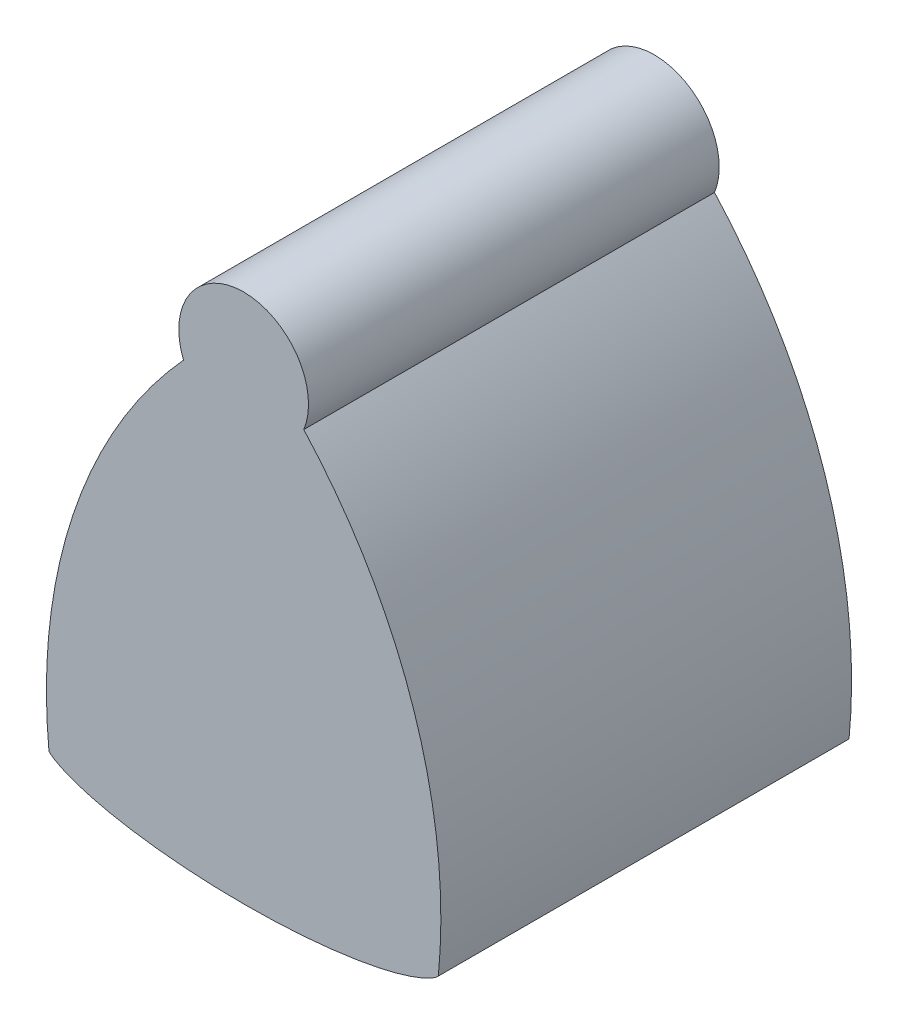
ISO-10303-21;
HEADER;
FILE_DESCRIPTION(('STEP AP214'),'2;1');
FILE_NAME('part.step','',(''),(''),'','','');
FILE_SCHEMA(('AUTOMOTIVE_DESIGN { 1 0 10303 214 1 1 1 1 }'));
ENDSEC;
DATA;
#1=APPLICATION_CONTEXT('core data for automotive mechanical design processes');
#2=APPLICATION_PROTOCOL_DEFINITION('international standard','automotive_design',2000,#1);
#3=PRODUCT_CONTEXT('',#1,'mechanical');
#4=PRODUCT('Part','Part','',(#3));
#5=PRODUCT_RELATED_PRODUCT_CATEGORY('part','',(#4));
#6=PRODUCT_DEFINITION_FORMATION('','',#4);
#7=PRODUCT_DEFINITION_CONTEXT('part definition',#1,'design');
#8=PRODUCT_DEFINITION('design','',#6,#7);
#9=PRODUCT_DEFINITION_SHAPE('','',#8);
#10=(LENGTH_UNIT() NAMED_UNIT(*) SI_UNIT(.MILLI.,.METRE.));
#11=(NAMED_UNIT(*) PLANE_ANGLE_UNIT() SI_UNIT($,.RADIAN.));
#12=(NAMED_UNIT(*) SI_UNIT($,.STERADIAN.) SOLID_ANGLE_UNIT());
#13=UNCERTAINTY_MEASURE_WITH_UNIT(LENGTH_MEASURE(1.E-05),#10,'distance_accuracy_value','');
#14=(GEOMETRIC_REPRESENTATION_CONTEXT(3) GLOBAL_UNCERTAINTY_ASSIGNED_CONTEXT((#13)) GLOBAL_UNIT_ASSIGNED_CONTEXT((#10,
#11,#12)) REPRESENTATION_CONTEXT('',''));
#15=CARTESIAN_POINT('',(0.,0.,0.));
#16=DIRECTION('',(0.,0.,1.));
#17=DIRECTION('',(1.,0.,0.));
#18=AXIS2_PLACEMENT_3D('',#15,#16,#17);
#19=CARTESIAN_POINT('',(0.,-2.00378215413677,0.));
#20=DIRECTION('',(0.,0.,1.));
#21=DIRECTION('',(1.,0.,0.));
#22=AXIS2_PLACEMENT_3D('',#19,#20,#21);
#23=PLANE('',#22);
#24=CARTESIAN_POINT('',(-3.04936702167842,-1.50378215413673,0.));
#25=DIRECTION('',(0.,0.,1.));
#26=DIRECTION('',(1.,0.,0.));
#27=AXIS2_PLACEMENT_3D('',#24,#25,#26);
#28=CIRCLE('',#27,4.87406221085371);
#29=CARTESIAN_POINT('',(1.80126129348835,-1.98115767024336,0.));
#30=VERTEX_POINT('',#29);
#31=CARTESIAN_POINT('',(0.55646432045147,1.7756176030423,0.));
#32=VERTEX_POINT('',#31);
#33=EDGE_CURVE('E90',#30,#32,#28,.T.);
#34=ORIENTED_EDGE('',*,*,#33,.F.);
#35=CARTESIAN_POINT('',(-1.80126129348779,-1.98115767024395,0.));
#36=CARTESIAN_POINT('',(-1.77541836187042,-2.00867060297214,0.));
#37=CARTESIAN_POINT('',(-1.739425369154,-2.0281270736785,0.));
#38=CARTESIAN_POINT('',(-1.67044975703758,-2.06329970538384,0.));
#39=CARTESIAN_POINT('',(-1.63477853614678,-2.07837819682223,0.));
#40=CARTESIAN_POINT('',(-1.52588733263277,-2.11963489494522,0.));
#41=CARTESIAN_POINT('',(-1.45127485605602,-2.14158140396786,0.));
#42=CARTESIAN_POINT('',(-1.22718316781472,-2.19853734035556,0.));
#43=CARTESIAN_POINT('',(-1.07576691897735,-2.22498867269726,0.));
#44=CARTESIAN_POINT('',(-0.618423536469617,-2.28671076174187,0.));
#45=CARTESIAN_POINT('',(-0.309020676910638,-2.30377928176756,0.));
#46=CARTESIAN_POINT('',(0.3088756567851,-2.30378502583191,0.));
#47=CARTESIAN_POINT('',(0.616691934660404,-2.2869181681506,0.));
#48=CARTESIAN_POINT('',(1.07595611746922,-2.224976253288,0.));
#49=CARTESIAN_POINT('',(1.22823692175977,-2.1983569929799,0.));
#50=CARTESIAN_POINT('',(1.45301136263338,-2.14109564450364,0.));
#51=CARTESIAN_POINT('',(1.52708176878054,-2.11922441898847,0.));
#52=CARTESIAN_POINT('',(1.635211184002,-2.0781929374193,0.));
#53=CARTESIAN_POINT('',(1.67084170509984,-2.06312956561559,0.));
#54=CARTESIAN_POINT('',(1.73996807213923,-2.02782020390134,0.));
#55=CARTESIAN_POINT('',(1.77534780982709,-2.00874571417318,0.));
#56=CARTESIAN_POINT('',(1.80126129348825,-1.98115767024346,0.));
#57=B_SPLINE_CURVE_WITH_KNOTS('',3,(#35,#36,#37,#38,#39,#40,#41,#42,#43,#44,#45,#46,#47,#48,#49,
#50,#51,#52,#53,#54,#55,#56),.UNSPECIFIED.,.F.,.F.,(4,2,2,2,2,2,2,2,2,2,4),(0.,0.03125,0.0625,
0.125,0.25,0.5,0.75,0.875,0.9375,0.96875,1.),.UNSPECIFIED.);
#58=CARTESIAN_POINT('',(-1.80126129348793,-1.9811576702439,0.));
#59=VERTEX_POINT('',#58);
#60=EDGE_CURVE('E110',#59,#30,#57,.T.);
#61=ORIENTED_EDGE('',*,*,#60,.F.);
#62=CARTESIAN_POINT('',(3.0493670216784,-1.50378215413677,0.));
#63=DIRECTION('',(0.,0.,1.));
#64=DIRECTION('',(1.,0.,0.));
#65=AXIS2_PLACEMENT_3D('',#62,#63,#64);
#66=CIRCLE('',#65,4.87406221085368);
#67=CARTESIAN_POINT('',(-0.556464320451457,1.77561760304227,0.));
#68=VERTEX_POINT('',#67);
#69=EDGE_CURVE('E116',#68,#59,#66,.T.);
#70=ORIENTED_EDGE('',*,*,#69,.F.);
#71=CARTESIAN_POINT('',(0.,2.,0.));
#72=DIRECTION('',(0.,0.,1.));
#73=DIRECTION('',(1.,0.,0.));
#74=AXIS2_PLACEMENT_3D('',#71,#72,#73);
#75=CIRCLE('',#74,0.6);
#76=EDGE_CURVE('E121',#32,#68,#75,.T.);
#77=ORIENTED_EDGE('',*,*,#76,.F.);
#78=EDGE_LOOP('',(#34,#61,#70,#77));
#79=FACE_BOUND('',#78,.T.);
#80=ADVANCED_FACE('F66',(#79),#23,.F.);
#81=CARTESIAN_POINT('',(-3.04936702167842,-1.50378215413673,0.));
#82=DIRECTION('',(0.,0.,1.));
#83=DIRECTION('',(1.,0.,0.));
#84=AXIS2_PLACEMENT_3D('',#81,#82,#83);
#85=CYLINDRICAL_SURFACE('',#84,4.87406221085371);
#86=CARTESIAN_POINT('',(-3.04936702167842,-1.50378215413673,3.8));
#87=DIRECTION('',(0.,0.,1.));
#88=DIRECTION('',(1.,0.,0.));
#89=AXIS2_PLACEMENT_3D('',#86,#87,#88);
#90=CIRCLE('',#89,4.87406221085371);
#91=CARTESIAN_POINT('',(1.80126129348835,-1.98115767024336,3.8));
#92=VERTEX_POINT('',#91);
#93=CARTESIAN_POINT('',(0.55646432045147,1.7756176030423,3.8));
#94=VERTEX_POINT('',#93);
#95=EDGE_CURVE('E129',#92,#94,#90,.T.);
#96=ORIENTED_EDGE('',*,*,#95,.F.);
#97=DIRECTION('',(0.,0.,1.));
#98=VECTOR('',#97,1.);
#99=CARTESIAN_POINT('',(1.80126129348835,-1.98115767024336,0.));
#100=LINE('',#99,#98);
#101=EDGE_CURVE('E12',#30,#92,#100,.T.);
#102=ORIENTED_EDGE('',*,*,#101,.F.);
#103=ORIENTED_EDGE('',*,*,#33,.T.);
#104=DIRECTION('',(0.,0.,1.));
#105=VECTOR('',#104,1.);
#106=CARTESIAN_POINT('',(0.55646432045147,1.7756176030423,0.));
#107=LINE('',#106,#105);
#108=EDGE_CURVE('E69',#32,#94,#107,.T.);
#109=ORIENTED_EDGE('',*,*,#108,.T.);
#110=EDGE_LOOP('',(#96,#102,#103,#109));
#111=FACE_BOUND('',#110,.T.);
#112=ADVANCED_FACE('F137',(#111),#85,.T.);
#113=DIRECTION('',(0.,0.,1.));
#114=VECTOR('',#113,1.);
#115=SURFACE_OF_LINEAR_EXTRUSION('',#57,#114);
#116=CARTESIAN_POINT('',(-1.80126129348779,-1.98115767024395,3.8));
#117=CARTESIAN_POINT('',(-1.77541836187042,-2.00867060297214,3.8));
#118=CARTESIAN_POINT('',(-1.739425369154,-2.0281270736785,3.8));
#119=CARTESIAN_POINT('',(-1.67044975703758,-2.06329970538384,3.8));
#120=CARTESIAN_POINT('',(-1.63477853614678,-2.07837819682223,3.8));
#121=CARTESIAN_POINT('',(-1.52588733263277,-2.11963489494522,3.8));
#122=CARTESIAN_POINT('',(-1.45127485605602,-2.14158140396786,3.8));
#123=CARTESIAN_POINT('',(-1.22718316781472,-2.19853734035556,3.8));
#124=CARTESIAN_POINT('',(-1.07576691897735,-2.22498867269726,3.8));
#125=CARTESIAN_POINT('',(-0.618423536469617,-2.28671076174187,3.8));
#126=CARTESIAN_POINT('',(-0.309020676910638,-2.30377928176756,3.8));
#127=CARTESIAN_POINT('',(0.3088756567851,-2.30378502583191,3.8));
#128=CARTESIAN_POINT('',(0.616691934660404,-2.2869181681506,3.8));
#129=CARTESIAN_POINT('',(1.07595611746922,-2.224976253288,3.8));
#130=CARTESIAN_POINT('',(1.22823692175977,-2.1983569929799,3.8));
#131=CARTESIAN_POINT('',(1.45301136263338,-2.14109564450364,3.8));
#132=CARTESIAN_POINT('',(1.52708176878054,-2.11922441898847,3.8));
#133=CARTESIAN_POINT('',(1.635211184002,-2.0781929374193,3.8));
#134=CARTESIAN_POINT('',(1.67084170509984,-2.06312956561559,3.8));
#135=CARTESIAN_POINT('',(1.73996807213923,-2.02782020390134,3.8));
#136=CARTESIAN_POINT('',(1.77534780982709,-2.00874571417318,3.8));
#137=CARTESIAN_POINT('',(1.80126129348825,-1.98115767024346,3.8));
#138=B_SPLINE_CURVE_WITH_KNOTS('',3,(#116,#117,#118,#119,#120,#121,#122,#123,#124,#125,#126,
#127,#128,#129,#130,#131,#132,#133,#134,#135,#136,#137),.UNSPECIFIED.,.F.,.F.,(4,2,2,2,2,2,2,2,
2,2,4),(0.,0.03125,0.0625,0.125,0.25,0.5,0.75,0.875,0.9375,0.96875,1.),.UNSPECIFIED.);
#139=CARTESIAN_POINT('',(-1.80126129348793,-1.9811576702439,3.8));
#140=VERTEX_POINT('',#139);
#141=EDGE_CURVE('E112',#140,#92,#138,.T.);
#142=ORIENTED_EDGE('',*,*,#141,.F.);
#143=DIRECTION('',(0.,0.,1.));
#144=VECTOR('',#143,1.);
#145=CARTESIAN_POINT('',(-1.80126129348793,-1.9811576702439,0.));
#146=LINE('',#145,#144);
#147=EDGE_CURVE('E74',#59,#140,#146,.T.);
#148=ORIENTED_EDGE('',*,*,#147,.F.);
#149=ORIENTED_EDGE('',*,*,#60,.T.);
#150=ORIENTED_EDGE('',*,*,#101,.T.);
#151=EDGE_LOOP('',(#142,#148,#149,#150));
#152=FACE_BOUND('',#151,.T.);
#153=ADVANCED_FACE('F108',(#152),#115,.T.);
#154=CARTESIAN_POINT('',(3.0493670216784,-1.50378215413677,0.));
#155=DIRECTION('',(0.,0.,1.));
#156=DIRECTION('',(1.,0.,0.));
#157=AXIS2_PLACEMENT_3D('',#154,#155,#156);
#158=CYLINDRICAL_SURFACE('',#157,4.87406221085368);
#159=CARTESIAN_POINT('',(3.0493670216784,-1.50378215413677,3.8));
#160=DIRECTION('',(0.,0.,1.));
#161=DIRECTION('',(1.,0.,0.));
#162=AXIS2_PLACEMENT_3D('',#159,#160,#161);
#163=CIRCLE('',#162,4.87406221085368);
#164=CARTESIAN_POINT('',(-0.556464320451457,1.77561760304227,3.8));
#165=VERTEX_POINT('',#164);
#166=EDGE_CURVE('E82',#165,#140,#163,.T.);
#167=ORIENTED_EDGE('',*,*,#166,.F.);
#168=DIRECTION('',(0.,0.,1.));
#169=VECTOR('',#168,1.);
#170=CARTESIAN_POINT('',(-0.556464320451457,1.77561760304227,0.));
#171=LINE('',#170,#169);
#172=EDGE_CURVE('E113',#68,#165,#171,.T.);
#173=ORIENTED_EDGE('',*,*,#172,.F.);
#174=ORIENTED_EDGE('',*,*,#69,.T.);
#175=ORIENTED_EDGE('',*,*,#147,.T.);
#176=EDGE_LOOP('',(#167,#173,#174,#175));
#177=FACE_BOUND('',#176,.T.);
#178=ADVANCED_FACE('F117',(#177),#158,.T.);
#179=CARTESIAN_POINT('',(0.,2.,0.));
#180=DIRECTION('',(0.,0.,1.));
#181=DIRECTION('',(1.,0.,0.));
#182=AXIS2_PLACEMENT_3D('',#179,#180,#181);
#183=CYLINDRICAL_SURFACE('',#182,0.6);
#184=CARTESIAN_POINT('',(0.,2.,3.8));
#185=DIRECTION('',(0.,0.,1.));
#186=DIRECTION('',(1.,0.,0.));
#187=AXIS2_PLACEMENT_3D('',#184,#185,#186);
#188=CIRCLE('',#187,0.6);
#189=EDGE_CURVE('E202',#94,#165,#188,.T.);
#190=ORIENTED_EDGE('',*,*,#189,.F.);
#191=ORIENTED_EDGE('',*,*,#108,.F.);
#192=ORIENTED_EDGE('',*,*,#76,.T.);
#193=ORIENTED_EDGE('',*,*,#172,.T.);
#194=EDGE_LOOP('',(#190,#191,#192,#193));
#195=FACE_BOUND('',#194,.T.);
#196=ADVANCED_FACE('F140',(#195),#183,.T.);
#197=CARTESIAN_POINT('',(0.,-2.00378215413677,3.8));
#198=DIRECTION('',(0.,0.,1.));
#199=DIRECTION('',(1.,0.,0.));
#200=AXIS2_PLACEMENT_3D('',#197,#198,#199);
#201=PLANE('',#200);
#202=ORIENTED_EDGE('',*,*,#141,.T.);
#203=ORIENTED_EDGE('',*,*,#95,.T.);
#204=ORIENTED_EDGE('',*,*,#189,.T.);
#205=ORIENTED_EDGE('',*,*,#166,.T.);
#206=EDGE_LOOP('',(#202,#203,#204,#205));
#207=FACE_BOUND('',#206,.T.);
#208=ADVANCED_FACE('F143',(#207),#201,.T.);
#209=CLOSED_SHELL('',(#80,#112,#153,#178,#196,#208));
#210=MANIFOLD_SOLID_BREP('B2',#209);
#211=ADVANCED_BREP_SHAPE_REPRESENTATION('',(#18,#210),#14);
#212=SHAPE_DEFINITION_REPRESENTATION(#9,#211);
ENDSEC;
END-ISO-10303-21;
